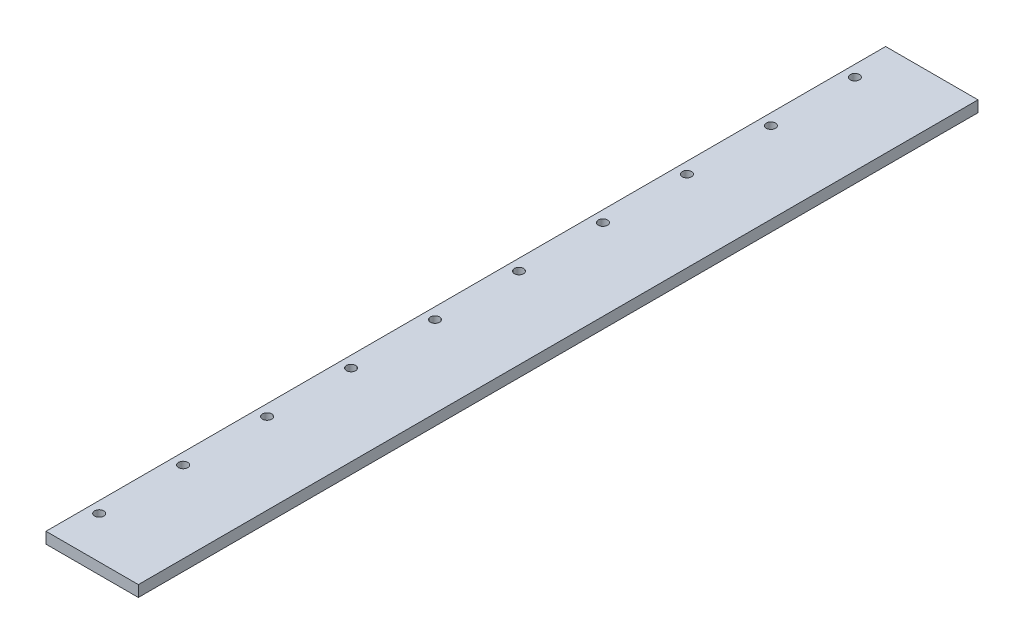
ISO-10303-21;
HEADER;
FILE_DESCRIPTION(('STEP AP214'),'2;1');
FILE_NAME('part.step','',(''),(''),'','','');
FILE_SCHEMA(('AUTOMOTIVE_DESIGN { 1 0 10303 214 1 1 1 1 }'));
ENDSEC;
DATA;
#1=APPLICATION_CONTEXT('core data for automotive mechanical design processes');
#2=APPLICATION_PROTOCOL_DEFINITION('international standard','automotive_design',2000,#1);
#3=PRODUCT_CONTEXT('',#1,'mechanical');
#4=PRODUCT('Part','Part','',(#3));
#5=PRODUCT_RELATED_PRODUCT_CATEGORY('part','',(#4));
#6=PRODUCT_DEFINITION_FORMATION('','',#4);
#7=PRODUCT_DEFINITION_CONTEXT('part definition',#1,'design');
#8=PRODUCT_DEFINITION('design','',#6,#7);
#9=PRODUCT_DEFINITION_SHAPE('','',#8);
#10=(LENGTH_UNIT() NAMED_UNIT(*) SI_UNIT(.MILLI.,.METRE.));
#11=(NAMED_UNIT(*) PLANE_ANGLE_UNIT() SI_UNIT($,.RADIAN.));
#12=(NAMED_UNIT(*) SI_UNIT($,.STERADIAN.) SOLID_ANGLE_UNIT());
#13=UNCERTAINTY_MEASURE_WITH_UNIT(LENGTH_MEASURE(1.E-05),#10,'distance_accuracy_value','');
#14=(GEOMETRIC_REPRESENTATION_CONTEXT(3) GLOBAL_UNCERTAINTY_ASSIGNED_CONTEXT((#13)) GLOBAL_UNIT_ASSIGNED_CONTEXT((#10,
#11,#12)) REPRESENTATION_CONTEXT('',''));
#15=CARTESIAN_POINT('',(0.,0.,0.));
#16=DIRECTION('',(0.,0.,1.));
#17=DIRECTION('',(1.,0.,0.));
#18=AXIS2_PLACEMENT_3D('',#15,#16,#17);
#19=CARTESIAN_POINT('',(-16.5,2.,300.));
#20=DIRECTION('',(0.,-1.,0.));
#21=DIRECTION('',(0.,0.,-1.));
#22=AXIS2_PLACEMENT_3D('',#19,#20,#21);
#23=PLANE('',#22);
#24=CARTESIAN_POINT('',(-12.5,2.,285.));
#25=DIRECTION('',(0.,1.,0.));
#26=DIRECTION('',(0.,0.,1.));
#27=AXIS2_PLACEMENT_3D('',#24,#25,#26);
#28=CIRCLE('',#27,1.65);
#29=CARTESIAN_POINT('',(-12.5,2.,286.65));
#30=VERTEX_POINT('',#29);
#31=EDGE_CURVE('E169',#30,#30,#28,.T.);
#32=ORIENTED_EDGE('',*,*,#31,.F.);
#33=EDGE_LOOP('',(#32));
#34=FACE_BOUND('',#33,.T.);
#35=CARTESIAN_POINT('',(-12.5,2.,255.));
#36=DIRECTION('',(0.,1.,0.));
#37=DIRECTION('',(0.,0.,1.));
#38=AXIS2_PLACEMENT_3D('',#35,#36,#37);
#39=CIRCLE('',#38,1.65);
#40=CARTESIAN_POINT('',(-12.5,2.,256.65));
#41=VERTEX_POINT('',#40);
#42=EDGE_CURVE('E163',#41,#41,#39,.T.);
#43=ORIENTED_EDGE('',*,*,#42,.F.);
#44=EDGE_LOOP('',(#43));
#45=FACE_BOUND('',#44,.T.);
#46=CARTESIAN_POINT('',(-12.5,2.,225.));
#47=DIRECTION('',(0.,1.,0.));
#48=DIRECTION('',(0.,0.,1.));
#49=AXIS2_PLACEMENT_3D('',#46,#47,#48);
#50=CIRCLE('',#49,1.65);
#51=CARTESIAN_POINT('',(-12.5,2.,226.65));
#52=VERTEX_POINT('',#51);
#53=EDGE_CURVE('E157',#52,#52,#50,.T.);
#54=ORIENTED_EDGE('',*,*,#53,.F.);
#55=EDGE_LOOP('',(#54));
#56=FACE_BOUND('',#55,.T.);
#57=CARTESIAN_POINT('',(-12.5,2.,195.));
#58=DIRECTION('',(0.,1.,0.));
#59=DIRECTION('',(0.,0.,1.));
#60=AXIS2_PLACEMENT_3D('',#57,#58,#59);
#61=CIRCLE('',#60,1.65);
#62=CARTESIAN_POINT('',(-12.5,2.,196.65));
#63=VERTEX_POINT('',#62);
#64=EDGE_CURVE('E151',#63,#63,#61,.T.);
#65=ORIENTED_EDGE('',*,*,#64,.F.);
#66=EDGE_LOOP('',(#65));
#67=FACE_BOUND('',#66,.T.);
#68=CARTESIAN_POINT('',(-12.5,2.,135.));
#69=DIRECTION('',(0.,1.,0.));
#70=DIRECTION('',(0.,0.,1.));
#71=AXIS2_PLACEMENT_3D('',#68,#69,#70);
#72=CIRCLE('',#71,1.65);
#73=CARTESIAN_POINT('',(-12.5,2.,136.65));
#74=VERTEX_POINT('',#73);
#75=EDGE_CURVE('E139',#74,#74,#72,.T.);
#76=ORIENTED_EDGE('',*,*,#75,.F.);
#77=EDGE_LOOP('',(#76));
#78=FACE_BOUND('',#77,.T.);
#79=CARTESIAN_POINT('',(-12.5,2.,105.));
#80=DIRECTION('',(0.,1.,0.));
#81=DIRECTION('',(0.,0.,1.));
#82=AXIS2_PLACEMENT_3D('',#79,#80,#81);
#83=CIRCLE('',#82,1.65);
#84=CARTESIAN_POINT('',(-12.5,2.,106.65));
#85=VERTEX_POINT('',#84);
#86=EDGE_CURVE('E133',#85,#85,#83,.T.);
#87=ORIENTED_EDGE('',*,*,#86,.F.);
#88=EDGE_LOOP('',(#87));
#89=FACE_BOUND('',#88,.T.);
#90=CARTESIAN_POINT('',(-12.5,2.,75.));
#91=DIRECTION('',(0.,1.,0.));
#92=DIRECTION('',(0.,0.,1.));
#93=AXIS2_PLACEMENT_3D('',#90,#91,#92);
#94=CIRCLE('',#93,1.65);
#95=CARTESIAN_POINT('',(-12.5,2.,76.65));
#96=VERTEX_POINT('',#95);
#97=EDGE_CURVE('E127',#96,#96,#94,.T.);
#98=ORIENTED_EDGE('',*,*,#97,.F.);
#99=EDGE_LOOP('',(#98));
#100=FACE_BOUND('',#99,.T.);
#101=CARTESIAN_POINT('',(-12.5,2.,45.));
#102=DIRECTION('',(0.,1.,0.));
#103=DIRECTION('',(0.,0.,1.));
#104=AXIS2_PLACEMENT_3D('',#101,#102,#103);
#105=CIRCLE('',#104,1.65);
#106=CARTESIAN_POINT('',(-12.5,2.,46.65));
#107=VERTEX_POINT('',#106);
#108=EDGE_CURVE('E121',#107,#107,#105,.T.);
#109=ORIENTED_EDGE('',*,*,#108,.F.);
#110=EDGE_LOOP('',(#109));
#111=FACE_BOUND('',#110,.T.);
#112=CARTESIAN_POINT('',(-12.5,2.,15.));
#113=DIRECTION('',(0.,1.,0.));
#114=DIRECTION('',(0.,0.,1.));
#115=AXIS2_PLACEMENT_3D('',#112,#113,#114);
#116=CIRCLE('',#115,1.65);
#117=CARTESIAN_POINT('',(-12.5,2.,16.65));
#118=VERTEX_POINT('',#117);
#119=EDGE_CURVE('E115',#118,#118,#116,.T.);
#120=ORIENTED_EDGE('',*,*,#119,.F.);
#121=EDGE_LOOP('',(#120));
#122=FACE_BOUND('',#121,.T.);
#123=DIRECTION('',(-1.,0.,0.));
#124=VECTOR('',#123,1.);
#125=CARTESIAN_POINT('',(-16.5,2.,0.));
#126=LINE('',#125,#124);
#127=CARTESIAN_POINT('',(16.5,2.,0.));
#128=VERTEX_POINT('',#127);
#129=CARTESIAN_POINT('',(-16.5,2.,0.));
#130=VERTEX_POINT('',#129);
#131=EDGE_CURVE('E91',#128,#130,#126,.T.);
#132=ORIENTED_EDGE('',*,*,#131,.T.);
#133=DIRECTION('',(0.,0.,-1.));
#134=VECTOR('',#133,1.);
#135=CARTESIAN_POINT('',(-16.5,2.,300.));
#136=LINE('',#135,#134);
#137=CARTESIAN_POINT('',(-16.5,2.,300.));
#138=VERTEX_POINT('',#137);
#139=EDGE_CURVE('E44',#138,#130,#136,.T.);
#140=ORIENTED_EDGE('',*,*,#139,.F.);
#141=DIRECTION('',(-1.,0.,0.));
#142=VECTOR('',#141,1.);
#143=CARTESIAN_POINT('',(-16.5,2.,300.));
#144=LINE('',#143,#142);
#145=CARTESIAN_POINT('',(16.5,2.,300.));
#146=VERTEX_POINT('',#145);
#147=EDGE_CURVE('E82',#146,#138,#144,.T.);
#148=ORIENTED_EDGE('',*,*,#147,.F.);
#149=DIRECTION('',(0.,0.,-1.));
#150=VECTOR('',#149,1.);
#151=CARTESIAN_POINT('',(16.5,2.,300.));
#152=LINE('',#151,#150);
#153=EDGE_CURVE('E11',#146,#128,#152,.T.);
#154=ORIENTED_EDGE('',*,*,#153,.T.);
#155=EDGE_LOOP('',(#132,#140,#148,#154));
#156=FACE_BOUND('',#155,.T.);
#157=CARTESIAN_POINT('',(-12.5,2.,165.));
#158=DIRECTION('',(0.,1.,0.));
#159=DIRECTION('',(0.,0.,1.));
#160=AXIS2_PLACEMENT_3D('',#157,#158,#159);
#161=CIRCLE('',#160,1.65);
#162=CARTESIAN_POINT('',(-12.5,2.,166.65));
#163=VERTEX_POINT('',#162);
#164=EDGE_CURVE('E145',#163,#163,#161,.T.);
#165=ORIENTED_EDGE('',*,*,#164,.F.);
#166=EDGE_LOOP('',(#165));
#167=FACE_BOUND('',#166,.T.);
#168=ADVANCED_FACE('F35',(#34,#45,#56,#67,#78,#89,#100,#111,#122,#156,#167),#23,.F.);
#169=CARTESIAN_POINT('',(16.5,-2.,300.));
#170=DIRECTION('',(-1.,0.,0.));
#171=DIRECTION('',(0.,0.,1.));
#172=AXIS2_PLACEMENT_3D('',#169,#170,#171);
#173=PLANE('',#172);
#174=DIRECTION('',(0.,1.,0.));
#175=VECTOR('',#174,1.);
#176=CARTESIAN_POINT('',(16.5,-2.,0.));
#177=LINE('',#176,#175);
#178=CARTESIAN_POINT('',(16.5,-2.,0.));
#179=VERTEX_POINT('',#178);
#180=EDGE_CURVE('E99',#179,#128,#177,.T.);
#181=ORIENTED_EDGE('',*,*,#180,.T.);
#182=ORIENTED_EDGE('',*,*,#153,.F.);
#183=DIRECTION('',(0.,1.,0.));
#184=VECTOR('',#183,1.);
#185=CARTESIAN_POINT('',(16.5,-2.,300.));
#186=LINE('',#185,#184);
#187=CARTESIAN_POINT('',(16.5,-2.,300.));
#188=VERTEX_POINT('',#187);
#189=EDGE_CURVE('E87',#188,#146,#186,.T.);
#190=ORIENTED_EDGE('',*,*,#189,.F.);
#191=DIRECTION('',(0.,0.,-1.));
#192=VECTOR('',#191,1.);
#193=CARTESIAN_POINT('',(16.5,-2.,300.));
#194=LINE('',#193,#192);
#195=EDGE_CURVE('E95',#188,#179,#194,.T.);
#196=ORIENTED_EDGE('',*,*,#195,.T.);
#197=EDGE_LOOP('',(#181,#182,#190,#196));
#198=FACE_BOUND('',#197,.T.);
#199=ADVANCED_FACE('F37',(#198),#173,.F.);
#200=CARTESIAN_POINT('',(-16.5,-2.,300.));
#201=DIRECTION('',(1.,0.,0.));
#202=DIRECTION('',(0.,0.,-1.));
#203=AXIS2_PLACEMENT_3D('',#200,#201,#202);
#204=PLANE('',#203);
#205=DIRECTION('',(0.,-1.,0.));
#206=VECTOR('',#205,1.);
#207=CARTESIAN_POINT('',(-16.5,-2.,0.));
#208=LINE('',#207,#206);
#209=CARTESIAN_POINT('',(-16.5,-2.,0.));
#210=VERTEX_POINT('',#209);
#211=EDGE_CURVE('E69',#130,#210,#208,.T.);
#212=ORIENTED_EDGE('',*,*,#211,.T.);
#213=DIRECTION('',(0.,0.,-1.));
#214=VECTOR('',#213,1.);
#215=CARTESIAN_POINT('',(-16.5,-2.,300.));
#216=LINE('',#215,#214);
#217=CARTESIAN_POINT('',(-16.5,-2.,300.));
#218=VERTEX_POINT('',#217);
#219=EDGE_CURVE('E92',#218,#210,#216,.T.);
#220=ORIENTED_EDGE('',*,*,#219,.F.);
#221=DIRECTION('',(0.,-1.,0.));
#222=VECTOR('',#221,1.);
#223=CARTESIAN_POINT('',(-16.5,-2.,300.));
#224=LINE('',#223,#222);
#225=EDGE_CURVE('E85',#138,#218,#224,.T.);
#226=ORIENTED_EDGE('',*,*,#225,.F.);
#227=ORIENTED_EDGE('',*,*,#139,.T.);
#228=EDGE_LOOP('',(#212,#220,#226,#227));
#229=FACE_BOUND('',#228,.T.);
#230=ADVANCED_FACE('F93',(#229),#204,.F.);
#231=CARTESIAN_POINT('',(-16.5,-2.,300.));
#232=DIRECTION('',(0.,1.,0.));
#233=DIRECTION('',(0.,0.,1.));
#234=AXIS2_PLACEMENT_3D('',#231,#232,#233);
#235=PLANE('',#234);
#236=CARTESIAN_POINT('',(-12.5,-2.,285.));
#237=DIRECTION('',(0.,1.,0.));
#238=DIRECTION('',(0.,0.,1.));
#239=AXIS2_PLACEMENT_3D('',#236,#237,#238);
#240=CIRCLE('',#239,1.65);
#241=CARTESIAN_POINT('',(-12.5,-2.,286.65));
#242=VERTEX_POINT('',#241);
#243=EDGE_CURVE('E166',#242,#242,#240,.T.);
#244=ORIENTED_EDGE('',*,*,#243,.T.);
#245=EDGE_LOOP('',(#244));
#246=FACE_BOUND('',#245,.T.);
#247=CARTESIAN_POINT('',(-12.5,-2.,255.));
#248=DIRECTION('',(0.,1.,0.));
#249=DIRECTION('',(0.,0.,1.));
#250=AXIS2_PLACEMENT_3D('',#247,#248,#249);
#251=CIRCLE('',#250,1.65);
#252=CARTESIAN_POINT('',(-12.5,-2.,256.65));
#253=VERTEX_POINT('',#252);
#254=EDGE_CURVE('E160',#253,#253,#251,.T.);
#255=ORIENTED_EDGE('',*,*,#254,.T.);
#256=EDGE_LOOP('',(#255));
#257=FACE_BOUND('',#256,.T.);
#258=CARTESIAN_POINT('',(-12.5,-2.,225.));
#259=DIRECTION('',(0.,1.,0.));
#260=DIRECTION('',(0.,0.,1.));
#261=AXIS2_PLACEMENT_3D('',#258,#259,#260);
#262=CIRCLE('',#261,1.65);
#263=CARTESIAN_POINT('',(-12.5,-2.,226.65));
#264=VERTEX_POINT('',#263);
#265=EDGE_CURVE('E154',#264,#264,#262,.T.);
#266=ORIENTED_EDGE('',*,*,#265,.T.);
#267=EDGE_LOOP('',(#266));
#268=FACE_BOUND('',#267,.T.);
#269=CARTESIAN_POINT('',(-12.5,-2.,195.));
#270=DIRECTION('',(0.,1.,0.));
#271=DIRECTION('',(0.,0.,1.));
#272=AXIS2_PLACEMENT_3D('',#269,#270,#271);
#273=CIRCLE('',#272,1.65);
#274=CARTESIAN_POINT('',(-12.5,-2.,196.65));
#275=VERTEX_POINT('',#274);
#276=EDGE_CURVE('E148',#275,#275,#273,.T.);
#277=ORIENTED_EDGE('',*,*,#276,.T.);
#278=EDGE_LOOP('',(#277));
#279=FACE_BOUND('',#278,.T.);
#280=CARTESIAN_POINT('',(-12.5,-2.,165.));
#281=DIRECTION('',(0.,1.,0.));
#282=DIRECTION('',(0.,0.,1.));
#283=AXIS2_PLACEMENT_3D('',#280,#281,#282);
#284=CIRCLE('',#283,1.65);
#285=CARTESIAN_POINT('',(-12.5,-2.,166.65));
#286=VERTEX_POINT('',#285);
#287=EDGE_CURVE('E142',#286,#286,#284,.T.);
#288=ORIENTED_EDGE('',*,*,#287,.T.);
#289=EDGE_LOOP('',(#288));
#290=FACE_BOUND('',#289,.T.);
#291=CARTESIAN_POINT('',(-12.5,-2.,135.));
#292=DIRECTION('',(0.,1.,0.));
#293=DIRECTION('',(0.,0.,1.));
#294=AXIS2_PLACEMENT_3D('',#291,#292,#293);
#295=CIRCLE('',#294,1.65);
#296=CARTESIAN_POINT('',(-12.5,-2.,136.65));
#297=VERTEX_POINT('',#296);
#298=EDGE_CURVE('E136',#297,#297,#295,.T.);
#299=ORIENTED_EDGE('',*,*,#298,.T.);
#300=EDGE_LOOP('',(#299));
#301=FACE_BOUND('',#300,.T.);
#302=CARTESIAN_POINT('',(-12.5,-2.,105.));
#303=DIRECTION('',(0.,1.,0.));
#304=DIRECTION('',(0.,0.,1.));
#305=AXIS2_PLACEMENT_3D('',#302,#303,#304);
#306=CIRCLE('',#305,1.65);
#307=CARTESIAN_POINT('',(-12.5,-2.,106.65));
#308=VERTEX_POINT('',#307);
#309=EDGE_CURVE('E130',#308,#308,#306,.T.);
#310=ORIENTED_EDGE('',*,*,#309,.T.);
#311=EDGE_LOOP('',(#310));
#312=FACE_BOUND('',#311,.T.);
#313=CARTESIAN_POINT('',(-12.5,-2.,75.));
#314=DIRECTION('',(0.,1.,0.));
#315=DIRECTION('',(0.,0.,1.));
#316=AXIS2_PLACEMENT_3D('',#313,#314,#315);
#317=CIRCLE('',#316,1.65);
#318=CARTESIAN_POINT('',(-12.5,-2.,76.65));
#319=VERTEX_POINT('',#318);
#320=EDGE_CURVE('E124',#319,#319,#317,.T.);
#321=ORIENTED_EDGE('',*,*,#320,.T.);
#322=EDGE_LOOP('',(#321));
#323=FACE_BOUND('',#322,.T.);
#324=CARTESIAN_POINT('',(-12.5,-2.,45.));
#325=DIRECTION('',(0.,1.,0.));
#326=DIRECTION('',(0.,0.,1.));
#327=AXIS2_PLACEMENT_3D('',#324,#325,#326);
#328=CIRCLE('',#327,1.65);
#329=CARTESIAN_POINT('',(-12.5,-2.,46.65));
#330=VERTEX_POINT('',#329);
#331=EDGE_CURVE('E118',#330,#330,#328,.T.);
#332=ORIENTED_EDGE('',*,*,#331,.T.);
#333=EDGE_LOOP('',(#332));
#334=FACE_BOUND('',#333,.T.);
#335=CARTESIAN_POINT('',(-12.5,-2.,15.));
#336=DIRECTION('',(0.,1.,0.));
#337=DIRECTION('',(0.,0.,1.));
#338=AXIS2_PLACEMENT_3D('',#335,#336,#337);
#339=CIRCLE('',#338,1.65);
#340=CARTESIAN_POINT('',(-12.5,-2.,16.65));
#341=VERTEX_POINT('',#340);
#342=EDGE_CURVE('E102',#341,#341,#339,.T.);
#343=ORIENTED_EDGE('',*,*,#342,.T.);
#344=EDGE_LOOP('',(#343));
#345=FACE_BOUND('',#344,.T.);
#346=DIRECTION('',(1.,0.,0.));
#347=VECTOR('',#346,1.);
#348=CARTESIAN_POINT('',(-16.5,-2.,0.));
#349=LINE('',#348,#347);
#350=EDGE_CURVE('E75',#210,#179,#349,.T.);
#351=ORIENTED_EDGE('',*,*,#350,.T.);
#352=ORIENTED_EDGE('',*,*,#195,.F.);
#353=DIRECTION('',(1.,0.,0.));
#354=VECTOR('',#353,1.);
#355=CARTESIAN_POINT('',(-16.5,-2.,300.));
#356=LINE('',#355,#354);
#357=EDGE_CURVE('E52',#218,#188,#356,.T.);
#358=ORIENTED_EDGE('',*,*,#357,.F.);
#359=ORIENTED_EDGE('',*,*,#219,.T.);
#360=EDGE_LOOP('',(#351,#352,#358,#359));
#361=FACE_BOUND('',#360,.T.);
#362=ADVANCED_FACE('F107',(#246,#257,#268,#279,#290,#301,#312,#323,#334,#345,#361),#235,.F.);
#363=CARTESIAN_POINT('',(0.,0.,300.));
#364=DIRECTION('',(0.,0.,-1.));
#365=DIRECTION('',(-1.,0.,0.));
#366=AXIS2_PLACEMENT_3D('',#363,#364,#365);
#367=PLANE('',#366);
#368=ORIENTED_EDGE('',*,*,#189,.T.);
#369=ORIENTED_EDGE('',*,*,#147,.T.);
#370=ORIENTED_EDGE('',*,*,#225,.T.);
#371=ORIENTED_EDGE('',*,*,#357,.T.);
#372=EDGE_LOOP('',(#368,#369,#370,#371));
#373=FACE_BOUND('',#372,.T.);
#374=ADVANCED_FACE('F83',(#373),#367,.F.);
#375=CARTESIAN_POINT('',(0.,0.,0.));
#376=DIRECTION('',(0.,0.,-1.));
#377=DIRECTION('',(-1.,0.,0.));
#378=AXIS2_PLACEMENT_3D('',#375,#376,#377);
#379=PLANE('',#378);
#380=ORIENTED_EDGE('',*,*,#180,.F.);
#381=ORIENTED_EDGE('',*,*,#350,.F.);
#382=ORIENTED_EDGE('',*,*,#211,.F.);
#383=ORIENTED_EDGE('',*,*,#131,.F.);
#384=EDGE_LOOP('',(#380,#381,#382,#383));
#385=FACE_BOUND('',#384,.T.);
#386=ADVANCED_FACE('F110',(#385),#379,.T.);
#387=CARTESIAN_POINT('',(-12.5,2.,15.));
#388=DIRECTION('',(0.,1.,0.));
#389=DIRECTION('',(0.,0.,1.));
#390=AXIS2_PLACEMENT_3D('',#387,#388,#389);
#391=CYLINDRICAL_SURFACE('',#390,1.65);
#392=ORIENTED_EDGE('',*,*,#342,.F.);
#393=EDGE_LOOP('',(#392));
#394=FACE_BOUND('',#393,.T.);
#395=ORIENTED_EDGE('',*,*,#119,.T.);
#396=EDGE_LOOP('',(#395));
#397=FACE_BOUND('',#396,.T.);
#398=ADVANCED_FACE('F193',(#394,#397),#391,.F.);
#399=CARTESIAN_POINT('',(-12.5,2.,45.));
#400=DIRECTION('',(0.,1.,0.));
#401=DIRECTION('',(0.,0.,1.));
#402=AXIS2_PLACEMENT_3D('',#399,#400,#401);
#403=CYLINDRICAL_SURFACE('',#402,1.65);
#404=ORIENTED_EDGE('',*,*,#331,.F.);
#405=EDGE_LOOP('',(#404));
#406=FACE_BOUND('',#405,.T.);
#407=ORIENTED_EDGE('',*,*,#108,.T.);
#408=EDGE_LOOP('',(#407));
#409=FACE_BOUND('',#408,.T.);
#410=ADVANCED_FACE('F195',(#406,#409),#403,.F.);
#411=CARTESIAN_POINT('',(-12.5,2.,75.));
#412=DIRECTION('',(0.,1.,0.));
#413=DIRECTION('',(0.,0.,1.));
#414=AXIS2_PLACEMENT_3D('',#411,#412,#413);
#415=CYLINDRICAL_SURFACE('',#414,1.65);
#416=ORIENTED_EDGE('',*,*,#320,.F.);
#417=EDGE_LOOP('',(#416));
#418=FACE_BOUND('',#417,.T.);
#419=ORIENTED_EDGE('',*,*,#97,.T.);
#420=EDGE_LOOP('',(#419));
#421=FACE_BOUND('',#420,.T.);
#422=ADVANCED_FACE('F202',(#418,#421),#415,.F.);
#423=CARTESIAN_POINT('',(-12.5,2.,105.));
#424=DIRECTION('',(0.,1.,0.));
#425=DIRECTION('',(0.,0.,1.));
#426=AXIS2_PLACEMENT_3D('',#423,#424,#425);
#427=CYLINDRICAL_SURFACE('',#426,1.65);
#428=ORIENTED_EDGE('',*,*,#309,.F.);
#429=EDGE_LOOP('',(#428));
#430=FACE_BOUND('',#429,.T.);
#431=ORIENTED_EDGE('',*,*,#86,.T.);
#432=EDGE_LOOP('',(#431));
#433=FACE_BOUND('',#432,.T.);
#434=ADVANCED_FACE('F254',(#430,#433),#427,.F.);
#435=CARTESIAN_POINT('',(-12.5,2.,135.));
#436=DIRECTION('',(0.,1.,0.));
#437=DIRECTION('',(0.,0.,1.));
#438=AXIS2_PLACEMENT_3D('',#435,#436,#437);
#439=CYLINDRICAL_SURFACE('',#438,1.65);
#440=ORIENTED_EDGE('',*,*,#298,.F.);
#441=EDGE_LOOP('',(#440));
#442=FACE_BOUND('',#441,.T.);
#443=ORIENTED_EDGE('',*,*,#75,.T.);
#444=EDGE_LOOP('',(#443));
#445=FACE_BOUND('',#444,.T.);
#446=ADVANCED_FACE('F264',(#442,#445),#439,.F.);
#447=CARTESIAN_POINT('',(-12.5,2.,165.));
#448=DIRECTION('',(0.,1.,0.));
#449=DIRECTION('',(0.,0.,1.));
#450=AXIS2_PLACEMENT_3D('',#447,#448,#449);
#451=CYLINDRICAL_SURFACE('',#450,1.65);
#452=ORIENTED_EDGE('',*,*,#287,.F.);
#453=EDGE_LOOP('',(#452));
#454=FACE_BOUND('',#453,.T.);
#455=ORIENTED_EDGE('',*,*,#164,.T.);
#456=EDGE_LOOP('',(#455));
#457=FACE_BOUND('',#456,.T.);
#458=ADVANCED_FACE('F275',(#454,#457),#451,.F.);
#459=CARTESIAN_POINT('',(-12.5,2.,195.));
#460=DIRECTION('',(0.,1.,0.));
#461=DIRECTION('',(0.,0.,1.));
#462=AXIS2_PLACEMENT_3D('',#459,#460,#461);
#463=CYLINDRICAL_SURFACE('',#462,1.65);
#464=ORIENTED_EDGE('',*,*,#276,.F.);
#465=EDGE_LOOP('',(#464));
#466=FACE_BOUND('',#465,.T.);
#467=ORIENTED_EDGE('',*,*,#64,.T.);
#468=EDGE_LOOP('',(#467));
#469=FACE_BOUND('',#468,.T.);
#470=ADVANCED_FACE('F286',(#466,#469),#463,.F.);
#471=CARTESIAN_POINT('',(-12.5,2.,225.));
#472=DIRECTION('',(0.,1.,0.));
#473=DIRECTION('',(0.,0.,1.));
#474=AXIS2_PLACEMENT_3D('',#471,#472,#473);
#475=CYLINDRICAL_SURFACE('',#474,1.65);
#476=ORIENTED_EDGE('',*,*,#265,.F.);
#477=EDGE_LOOP('',(#476));
#478=FACE_BOUND('',#477,.T.);
#479=ORIENTED_EDGE('',*,*,#53,.T.);
#480=EDGE_LOOP('',(#479));
#481=FACE_BOUND('',#480,.T.);
#482=ADVANCED_FACE('F297',(#478,#481),#475,.F.);
#483=CARTESIAN_POINT('',(-12.5,2.,255.));
#484=DIRECTION('',(0.,1.,0.));
#485=DIRECTION('',(0.,0.,1.));
#486=AXIS2_PLACEMENT_3D('',#483,#484,#485);
#487=CYLINDRICAL_SURFACE('',#486,1.65);
#488=ORIENTED_EDGE('',*,*,#254,.F.);
#489=EDGE_LOOP('',(#488));
#490=FACE_BOUND('',#489,.T.);
#491=ORIENTED_EDGE('',*,*,#42,.T.);
#492=EDGE_LOOP('',(#491));
#493=FACE_BOUND('',#492,.T.);
#494=ADVANCED_FACE('F308',(#490,#493),#487,.F.);
#495=CARTESIAN_POINT('',(-12.5,2.,285.));
#496=DIRECTION('',(0.,1.,0.));
#497=DIRECTION('',(0.,0.,1.));
#498=AXIS2_PLACEMENT_3D('',#495,#496,#497);
#499=CYLINDRICAL_SURFACE('',#498,1.65);
#500=ORIENTED_EDGE('',*,*,#243,.F.);
#501=EDGE_LOOP('',(#500));
#502=FACE_BOUND('',#501,.T.);
#503=ORIENTED_EDGE('',*,*,#31,.T.);
#504=EDGE_LOOP('',(#503));
#505=FACE_BOUND('',#504,.T.);
#506=ADVANCED_FACE('F173',(#502,#505),#499,.F.);
#507=CLOSED_SHELL('',(#168,#199,#230,#362,#374,#386,#398,#410,#422,#434,#446,#458,#470,#482,
#494,#506));
#508=MANIFOLD_SOLID_BREP('B2',#507);
#509=ADVANCED_BREP_SHAPE_REPRESENTATION('',(#18,#508),#14);
#510=SHAPE_DEFINITION_REPRESENTATION(#9,#509);
ENDSEC;
END-ISO-10303-21;
